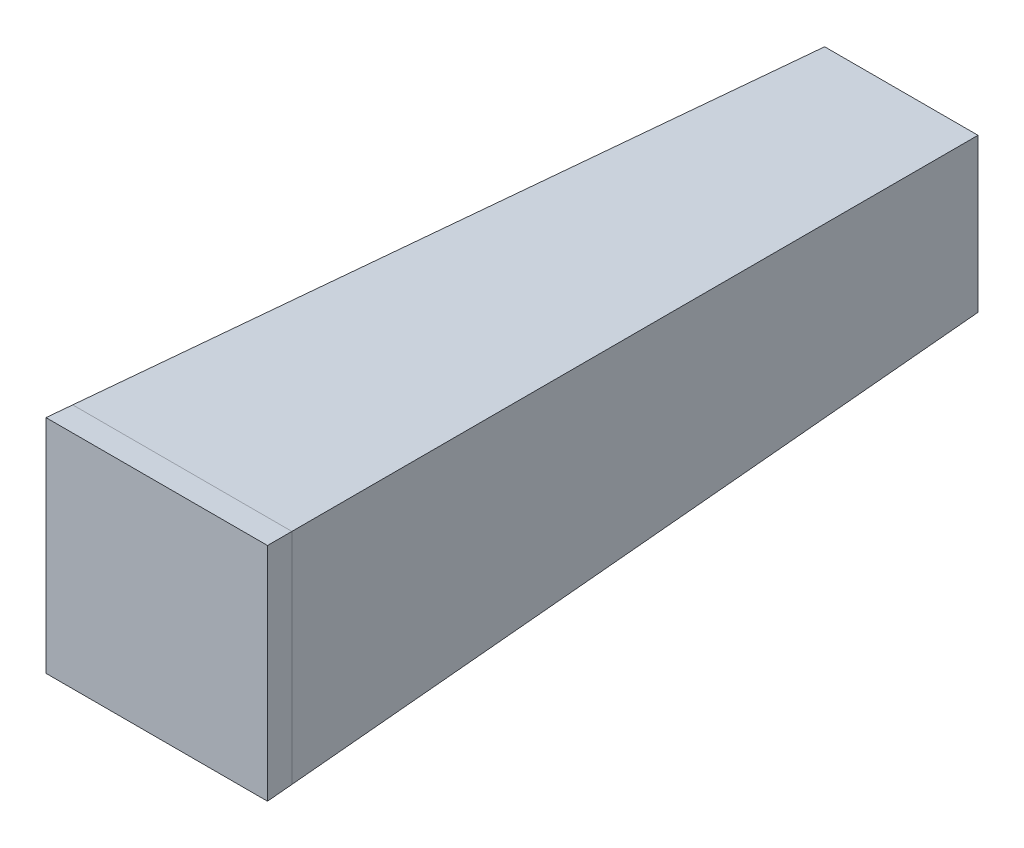
ISO-10303-21;
HEADER;
FILE_DESCRIPTION(('STEP AP214'),'2;1');
FILE_NAME('part.step','',(''),(''),'','','');
FILE_SCHEMA(('AUTOMOTIVE_DESIGN { 1 0 10303 214 1 1 1 1 }'));
ENDSEC;
DATA;
#1=APPLICATION_CONTEXT('core data for automotive mechanical design processes');
#2=APPLICATION_PROTOCOL_DEFINITION('international standard','automotive_design',2000,#1);
#3=PRODUCT_CONTEXT('',#1,'mechanical');
#4=PRODUCT('Part','Part','',(#3));
#5=PRODUCT_RELATED_PRODUCT_CATEGORY('part','',(#4));
#6=PRODUCT_DEFINITION_FORMATION('','',#4);
#7=PRODUCT_DEFINITION_CONTEXT('part definition',#1,'design');
#8=PRODUCT_DEFINITION('design','',#6,#7);
#9=PRODUCT_DEFINITION_SHAPE('','',#8);
#10=(LENGTH_UNIT() NAMED_UNIT(*) SI_UNIT(.MILLI.,.METRE.));
#11=(NAMED_UNIT(*) PLANE_ANGLE_UNIT() SI_UNIT($,.RADIAN.));
#12=(NAMED_UNIT(*) SI_UNIT($,.STERADIAN.) SOLID_ANGLE_UNIT());
#13=UNCERTAINTY_MEASURE_WITH_UNIT(LENGTH_MEASURE(1.E-05),#10,'distance_accuracy_value','');
#14=(GEOMETRIC_REPRESENTATION_CONTEXT(3) GLOBAL_UNCERTAINTY_ASSIGNED_CONTEXT((#13)) GLOBAL_UNIT_ASSIGNED_CONTEXT((#10,
#11,#12)) REPRESENTATION_CONTEXT('',''));
#15=CARTESIAN_POINT('',(0.,0.,0.));
#16=DIRECTION('',(0.,0.,1.));
#17=DIRECTION('',(1.,0.,0.));
#18=AXIS2_PLACEMENT_3D('',#15,#16,#17);
#19=CARTESIAN_POINT('',(241.993125845879,1.0333320773658E-13,-11.075200267546));
#20=DIRECTION('',(-0.998954351961386,0.,0.0457187346435417));
#21=DIRECTION('',(0.0457187346435417,0.,0.998954351961386));
#22=AXIS2_PLACEMENT_3D('',#19,#20,#21);
#23=PLANE('',#22);
#24=DIRECTION('',(0.,1.,0.));
#25=VECTOR('',#24,1.);
#26=CARTESIAN_POINT('',(281.12700228833,1.20043719532443E-13,844.));
#27=LINE('',#26,#25);
#28=CARTESIAN_POINT('',(281.12700228833,23.8729977116704,844.));
#29=VERTEX_POINT('',#28);
#30=CARTESIAN_POINT('',(281.12700228833,281.127002288329,844.));
#31=VERTEX_POINT('',#30);
#32=EDGE_CURVE('E111',#29,#31,#27,.T.);
#33=ORIENTED_EDGE('',*,*,#32,.F.);
#34=DIRECTION('',(0.0456710287056021,-0.0456710287056019,0.997911977217402));
#35=VECTOR('',#34,1.);
#36=CARTESIAN_POINT('',(242.5,62.5,0.));
#37=LINE('',#36,#35);
#38=CARTESIAN_POINT('',(242.5,62.5,0.));
#39=VERTEX_POINT('',#38);
#40=EDGE_CURVE('E162',#39,#29,#37,.T.);
#41=ORIENTED_EDGE('',*,*,#40,.F.);
#42=DIRECTION('',(0.,-1.,0.));
#43=VECTOR('',#42,1.);
#44=CARTESIAN_POINT('',(242.5,242.5,0.));
#45=LINE('',#44,#43);
#46=CARTESIAN_POINT('',(242.5,242.5,0.));
#47=VERTEX_POINT('',#46);
#48=EDGE_CURVE('E61',#47,#39,#45,.T.);
#49=ORIENTED_EDGE('',*,*,#48,.F.);
#50=DIRECTION('',(0.0456710287056019,0.0456710287056019,0.997911977217402));
#51=VECTOR('',#50,1.);
#52=CARTESIAN_POINT('',(242.5,242.5,0.));
#53=LINE('',#52,#51);
#54=EDGE_CURVE('E13',#47,#31,#53,.T.);
#55=ORIENTED_EDGE('',*,*,#54,.T.);
#56=EDGE_LOOP('',(#33,#41,#49,#55));
#57=FACE_BOUND('',#56,.T.);
#58=ADVANCED_FACE('F52',(#57),#23,.F.);
#59=CARTESIAN_POINT('',(0.,241.993125845879,-11.075200267546));
#60=DIRECTION('',(0.,-0.998954351961386,0.0457187346435418));
#61=DIRECTION('',(0.,-0.0457187346435418,-0.998954351961386));
#62=AXIS2_PLACEMENT_3D('',#59,#60,#61);
#63=PLANE('',#62);
#64=DIRECTION('',(-1.,0.,0.));
#65=VECTOR('',#64,1.);
#66=CARTESIAN_POINT('',(0.,281.12700228833,844.));
#67=LINE('',#66,#65);
#68=CARTESIAN_POINT('',(23.8729977116704,281.12700228833,844.));
#69=VERTEX_POINT('',#68);
#70=EDGE_CURVE('E119',#31,#69,#67,.T.);
#71=ORIENTED_EDGE('',*,*,#70,.F.);
#72=ORIENTED_EDGE('',*,*,#54,.F.);
#73=DIRECTION('',(1.,0.,0.));
#74=VECTOR('',#73,1.);
#75=CARTESIAN_POINT('',(242.5,242.5,0.));
#76=LINE('',#75,#74);
#77=CARTESIAN_POINT('',(62.5,242.5,0.));
#78=VERTEX_POINT('',#77);
#79=EDGE_CURVE('E69',#78,#47,#76,.T.);
#80=ORIENTED_EDGE('',*,*,#79,.F.);
#81=DIRECTION('',(-0.045671028705602,0.045671028705602,0.997911977217402));
#82=VECTOR('',#81,1.);
#83=CARTESIAN_POINT('',(62.5,242.5,0.));
#84=LINE('',#83,#82);
#85=EDGE_CURVE('E127',#78,#69,#84,.T.);
#86=ORIENTED_EDGE('',*,*,#85,.T.);
#87=EDGE_LOOP('',(#71,#72,#80,#86));
#88=FACE_BOUND('',#87,.T.);
#89=ADVANCED_FACE('F125',(#88),#63,.F.);
#90=CARTESIAN_POINT('',(0.,0.,0.));
#91=DIRECTION('',(0.,0.,1.));
#92=DIRECTION('',(1.,0.,0.));
#93=AXIS2_PLACEMENT_3D('',#90,#91,#92);
#94=PLANE('',#93);
#95=ORIENTED_EDGE('',*,*,#48,.T.);
#96=DIRECTION('',(-1.,0.,0.));
#97=VECTOR('',#96,1.);
#98=CARTESIAN_POINT('',(242.5,62.5,0.));
#99=LINE('',#98,#97);
#100=CARTESIAN_POINT('',(62.5,62.5000000000001,0.));
#101=VERTEX_POINT('',#100);
#102=EDGE_CURVE('E166',#39,#101,#99,.T.);
#103=ORIENTED_EDGE('',*,*,#102,.T.);
#104=DIRECTION('',(0.,1.,0.));
#105=VECTOR('',#104,1.);
#106=CARTESIAN_POINT('',(62.5,242.5,0.));
#107=LINE('',#106,#105);
#108=EDGE_CURVE('E152',#101,#78,#107,.T.);
#109=ORIENTED_EDGE('',*,*,#108,.T.);
#110=ORIENTED_EDGE('',*,*,#79,.T.);
#111=EDGE_LOOP('',(#95,#103,#109,#110));
#112=FACE_BOUND('',#111,.T.);
#113=ADVANCED_FACE('F206',(#112),#94,.F.);
#114=CARTESIAN_POINT('',(0.,0.,35.));
#115=DIRECTION('',(0.,0.,-1.));
#116=DIRECTION('',(-1.,0.,0.));
#117=AXIS2_PLACEMENT_3D('',#114,#115,#116);
#118=PLANE('',#117);
#119=DIRECTION('',(-1.,0.,0.));
#120=VECTOR('',#119,1.);
#121=CARTESIAN_POINT('',(0.,60.8981693363844,35.));
#122=LINE('',#121,#120);
#123=CARTESIAN_POINT('',(73.9117769896424,60.8981693363844,35.));
#124=VERTEX_POINT('',#123);
#125=CARTESIAN_POINT('',(60.8981693363844,60.8981693363844,35.));
#126=VERTEX_POINT('',#125);
#127=EDGE_CURVE('E160',#124,#126,#122,.T.);
#128=ORIENTED_EDGE('',*,*,#127,.F.);
#129=DIRECTION('',(0.,-1.,0.));
#130=VECTOR('',#129,1.);
#131=CARTESIAN_POINT('',(73.9117769897024,0.,35.));
#132=LINE('',#131,#130);
#133=CARTESIAN_POINT('',(73.9117769896424,231.088223010298,35.));
#134=VERTEX_POINT('',#133);
#135=EDGE_CURVE('E143',#134,#124,#132,.T.);
#136=ORIENTED_EDGE('',*,*,#135,.F.);
#137=DIRECTION('',(-1.,0.,0.));
#138=VECTOR('',#137,1.);
#139=CARTESIAN_POINT('',(0.,231.088223010298,35.));
#140=LINE('',#139,#138);
#141=CARTESIAN_POINT('',(60.8981693363844,231.088223010298,35.));
#142=VERTEX_POINT('',#141);
#143=EDGE_CURVE('E129',#134,#142,#140,.T.);
#144=ORIENTED_EDGE('',*,*,#143,.T.);
#145=DIRECTION('',(0.,1.,0.));
#146=VECTOR('',#145,1.);
#147=CARTESIAN_POINT('',(60.8981693363844,0.,35.));
#148=LINE('',#147,#146);
#149=EDGE_CURVE('E149',#126,#142,#148,.T.);
#150=ORIENTED_EDGE('',*,*,#149,.F.);
#151=EDGE_LOOP('',(#128,#136,#144,#150));
#152=FACE_BOUND('',#151,.T.);
#153=ADVANCED_FACE('F54',(#152),#118,.F.);
#154=CARTESIAN_POINT('',(0.,62.3693623314121,2.85443305864586));
#155=DIRECTION('',(0.,0.998954351961386,0.0457187346435418));
#156=DIRECTION('',(0.,-0.0457187346435418,0.998954351961386));
#157=AXIS2_PLACEMENT_3D('',#154,#155,#156);
#158=PLANE('',#157);
#159=ORIENTED_EDGE('',*,*,#40,.T.);
#160=DIRECTION('',(1.,0.,0.));
#161=VECTOR('',#160,1.);
#162=CARTESIAN_POINT('',(0.,23.8729977116705,844.));
#163=LINE('',#162,#161);
#164=CARTESIAN_POINT('',(36.8866053649885,23.8729977116705,844.));
#165=VERTEX_POINT('',#164);
#166=EDGE_CURVE('E122',#165,#29,#163,.T.);
#167=ORIENTED_EDGE('',*,*,#166,.F.);
#168=DIRECTION('',(-0.0456710287056019,-0.0456710287056019,0.997911977217402));
#169=VECTOR('',#168,1.);
#170=CARTESIAN_POINT('',(75.2257329547936,62.2121253014756,6.29006216275832));
#171=LINE('',#170,#169);
#172=EDGE_CURVE('E139',#124,#165,#171,.T.);
#173=ORIENTED_EDGE('',*,*,#172,.F.);
#174=ORIENTED_EDGE('',*,*,#127,.T.);
#175=DIRECTION('',(-0.0456710287056019,-0.045671028705602,0.997911977217402));
#176=VECTOR('',#175,1.);
#177=CARTESIAN_POINT('',(62.5,62.5,0.));
#178=LINE('',#177,#176);
#179=EDGE_CURVE('E142',#101,#126,#178,.T.);
#180=ORIENTED_EDGE('',*,*,#179,.F.);
#181=ORIENTED_EDGE('',*,*,#102,.F.);
#182=EDGE_LOOP('',(#159,#167,#173,#174,#180,#181));
#183=FACE_BOUND('',#182,.T.);
#184=ADVANCED_FACE('F198',(#183),#158,.F.);
#185=CARTESIAN_POINT('',(62.3693623314121,0.,2.85443305864586));
#186=DIRECTION('',(0.998954351961386,0.,0.0457187346435417));
#187=DIRECTION('',(0.0457187346435417,0.,-0.998954351961386));
#188=AXIS2_PLACEMENT_3D('',#185,#186,#187);
#189=PLANE('',#188);
#190=ORIENTED_EDGE('',*,*,#108,.F.);
#191=ORIENTED_EDGE('',*,*,#179,.T.);
#192=ORIENTED_EDGE('',*,*,#149,.T.);
#193=DIRECTION('',(-0.0456710287056019,0.045671028705602,0.997911977217402));
#194=VECTOR('',#193,1.);
#195=CARTESIAN_POINT('',(62.8483073746991,229.138084971983,-7.61051613717548));
#196=LINE('',#195,#194);
#197=CARTESIAN_POINT('',(23.8729977116705,268.113394635012,844.));
#198=VERTEX_POINT('',#197);
#199=EDGE_CURVE('E123',#142,#198,#196,.T.);
#200=ORIENTED_EDGE('',*,*,#199,.T.);
#201=DIRECTION('',(0.,-1.,0.));
#202=VECTOR('',#201,1.);
#203=CARTESIAN_POINT('',(23.8729977116705,0.,844.));
#204=LINE('',#203,#202);
#205=EDGE_CURVE('E128',#69,#198,#204,.T.);
#206=ORIENTED_EDGE('',*,*,#205,.F.);
#207=ORIENTED_EDGE('',*,*,#85,.F.);
#208=EDGE_LOOP('',(#190,#191,#192,#200,#206,#207));
#209=FACE_BOUND('',#208,.T.);
#210=ADVANCED_FACE('F204',(#209),#189,.F.);
#211=CARTESIAN_POINT('',(0.,229.006719270381,-10.4808567171799));
#212=DIRECTION('',(0.,0.998954351961386,-0.0457187346435418));
#213=DIRECTION('',(0.,0.0457187346435418,0.998954351961386));
#214=AXIS2_PLACEMENT_3D('',#211,#212,#213);
#215=PLANE('',#214);
#216=ORIENTED_EDGE('',*,*,#143,.F.);
#217=DIRECTION('',(-0.0456710287056019,0.045671028705602,0.997911977217402));
#218=VECTOR('',#217,1.);
#219=CARTESIAN_POINT('',(75.8347706873712,229.165229312629,-7.01741229406215));
#220=LINE('',#219,#218);
#221=CARTESIAN_POINT('',(36.8866053649885,268.113394635012,844.));
#222=VERTEX_POINT('',#221);
#223=EDGE_CURVE('E184',#134,#222,#220,.T.);
#224=ORIENTED_EDGE('',*,*,#223,.T.);
#225=DIRECTION('',(-1.,0.,0.));
#226=VECTOR('',#225,1.);
#227=CARTESIAN_POINT('',(0.,268.113394635012,844.));
#228=LINE('',#227,#226);
#229=EDGE_CURVE('E134',#222,#198,#228,.T.);
#230=ORIENTED_EDGE('',*,*,#229,.T.);
#231=ORIENTED_EDGE('',*,*,#199,.F.);
#232=EDGE_LOOP('',(#216,#224,#230,#231));
#233=FACE_BOUND('',#232,.T.);
#234=ADVANCED_FACE('F201',(#233),#215,.F.);
#235=CARTESIAN_POINT('',(0.,0.,844.));
#236=DIRECTION('',(0.,0.,1.));
#237=DIRECTION('',(1.,0.,0.));
#238=AXIS2_PLACEMENT_3D('',#235,#236,#237);
#239=PLANE('',#238);
#240=ORIENTED_EDGE('',*,*,#70,.T.);
#241=ORIENTED_EDGE('',*,*,#205,.T.);
#242=ORIENTED_EDGE('',*,*,#229,.F.);
#243=DIRECTION('',(0.,-1.,0.));
#244=VECTOR('',#243,1.);
#245=CARTESIAN_POINT('',(36.8866053649885,0.,844.));
#246=LINE('',#245,#244);
#247=EDGE_CURVE('E131',#222,#165,#246,.T.);
#248=ORIENTED_EDGE('',*,*,#247,.T.);
#249=ORIENTED_EDGE('',*,*,#166,.T.);
#250=ORIENTED_EDGE('',*,*,#32,.T.);
#251=EDGE_LOOP('',(#240,#241,#242,#248,#249,#250));
#252=FACE_BOUND('',#251,.T.);
#253=ADVANCED_FACE('F117',(#252),#239,.T.);
#254=CARTESIAN_POINT('',(75.3557689069101,0.,3.4487766090119));
#255=DIRECTION('',(-0.998954351961386,0.,-0.0457187346435417));
#256=DIRECTION('',(-0.0457187346435417,0.,0.998954351961386));
#257=AXIS2_PLACEMENT_3D('',#254,#255,#256);
#258=PLANE('',#257);
#259=ORIENTED_EDGE('',*,*,#247,.F.);
#260=ORIENTED_EDGE('',*,*,#223,.F.);
#261=ORIENTED_EDGE('',*,*,#135,.T.);
#262=ORIENTED_EDGE('',*,*,#172,.T.);
#263=EDGE_LOOP('',(#259,#260,#261,#262));
#264=FACE_BOUND('',#263,.T.);
#265=ADVANCED_FACE('F192',(#264),#258,.T.);
#266=CLOSED_SHELL('',(#58,#89,#113,#153,#184,#210,#234,#253,#265));
#267=MANIFOLD_SOLID_BREP('B2',#266);
#268=CARTESIAN_POINT('',(75.3557689069101,0.,3.4487766090119));
#269=DIRECTION('',(-0.998954351961386,0.,-0.0457187346435417));
#270=DIRECTION('',(-0.0457187346435417,0.,0.998954351961386));
#271=AXIS2_PLACEMENT_3D('',#268,#269,#270);
#272=PLANE('',#271);
#273=DIRECTION('',(0.,-1.,0.));
#274=VECTOR('',#273,1.);
#275=CARTESIAN_POINT('',(36.8866053649885,0.,844.));
#276=LINE('',#275,#274);
#277=CARTESIAN_POINT('',(36.8866053649885,268.113394635012,844.));
#278=VERTEX_POINT('',#277);
#279=CARTESIAN_POINT('',(36.8866053649885,23.8729977116705,844.));
#280=VERTEX_POINT('',#279);
#281=EDGE_CURVE('E365',#278,#280,#276,.T.);
#282=ORIENTED_EDGE('',*,*,#281,.T.);
#283=DIRECTION('',(-0.0456710287056019,-0.0456710287056019,0.997911977217402));
#284=VECTOR('',#283,1.);
#285=CARTESIAN_POINT('',(75.2257329547936,62.2121253014756,6.29006216275832));
#286=LINE('',#285,#284);
#287=CARTESIAN_POINT('',(73.9117769896424,60.8981693363844,35.));
#288=VERTEX_POINT('',#287);
#289=EDGE_CURVE('E322',#288,#280,#286,.T.);
#290=ORIENTED_EDGE('',*,*,#289,.F.);
#291=DIRECTION('',(0.,-1.,0.));
#292=VECTOR('',#291,1.);
#293=CARTESIAN_POINT('',(73.9117769897024,0.,35.));
#294=LINE('',#293,#292);
#295=CARTESIAN_POINT('',(73.9117769896424,231.088223010298,35.));
#296=VERTEX_POINT('',#295);
#297=EDGE_CURVE('E50',#296,#288,#294,.T.);
#298=ORIENTED_EDGE('',*,*,#297,.F.);
#299=DIRECTION('',(-0.0456710287056019,0.045671028705602,0.997911977217402));
#300=VECTOR('',#299,1.);
#301=CARTESIAN_POINT('',(75.8347706873712,229.165229312629,-7.01741229406215));
#302=LINE('',#301,#300);
#303=EDGE_CURVE('E301',#296,#278,#302,.T.);
#304=ORIENTED_EDGE('',*,*,#303,.T.);
#305=EDGE_LOOP('',(#282,#290,#298,#304));
#306=FACE_BOUND('',#305,.T.);
#307=ADVANCED_FACE('F297',(#306),#272,.F.);
#308=CARTESIAN_POINT('',(0.,229.006719270381,-10.4808567171799));
#309=DIRECTION('',(0.,0.998954351961386,-0.0457187346435418));
#310=DIRECTION('',(0.,0.0457187346435418,0.998954351961386));
#311=AXIS2_PLACEMENT_3D('',#308,#309,#310);
#312=PLANE('',#311);
#313=DIRECTION('',(-1.,0.,0.));
#314=VECTOR('',#313,1.);
#315=CARTESIAN_POINT('',(0.,268.113394635012,844.));
#316=LINE('',#315,#314);
#317=CARTESIAN_POINT('',(23.8729977116705,268.113394635012,844.));
#318=VERTEX_POINT('',#317);
#319=EDGE_CURVE('E347',#278,#318,#316,.T.);
#320=ORIENTED_EDGE('',*,*,#319,.F.);
#321=ORIENTED_EDGE('',*,*,#303,.F.);
#322=DIRECTION('',(-1.,0.,0.));
#323=VECTOR('',#322,1.);
#324=CARTESIAN_POINT('',(0.,231.088223010298,35.));
#325=LINE('',#324,#323);
#326=CARTESIAN_POINT('',(60.8981693363844,231.088223010298,35.));
#327=VERTEX_POINT('',#326);
#328=EDGE_CURVE('E346',#296,#327,#325,.T.);
#329=ORIENTED_EDGE('',*,*,#328,.T.);
#330=DIRECTION('',(-0.0456710287056019,0.045671028705602,0.997911977217402));
#331=VECTOR('',#330,1.);
#332=CARTESIAN_POINT('',(62.8483073746991,229.138084971983,-7.61051613717548));
#333=LINE('',#332,#331);
#334=EDGE_CURVE('E358',#327,#318,#333,.T.);
#335=ORIENTED_EDGE('',*,*,#334,.T.);
#336=EDGE_LOOP('',(#320,#321,#329,#335));
#337=FACE_BOUND('',#336,.T.);
#338=ADVANCED_FACE('F343',(#337),#312,.T.);
#339=CARTESIAN_POINT('',(0.,0.,35.));
#340=DIRECTION('',(0.,0.,-1.));
#341=DIRECTION('',(-1.,0.,0.));
#342=AXIS2_PLACEMENT_3D('',#339,#340,#341);
#343=PLANE('',#342);
#344=ORIENTED_EDGE('',*,*,#297,.T.);
#345=DIRECTION('',(-1.,0.,0.));
#346=VECTOR('',#345,1.);
#347=CARTESIAN_POINT('',(0.,60.8981693363844,35.));
#348=LINE('',#347,#346);
#349=CARTESIAN_POINT('',(60.8981693363844,60.8981693363844,35.));
#350=VERTEX_POINT('',#349);
#351=EDGE_CURVE('E356',#288,#350,#348,.T.);
#352=ORIENTED_EDGE('',*,*,#351,.T.);
#353=DIRECTION('',(0.,1.,0.));
#354=VECTOR('',#353,1.);
#355=CARTESIAN_POINT('',(60.8981693363844,0.,35.));
#356=LINE('',#355,#354);
#357=EDGE_CURVE('E354',#350,#327,#356,.T.);
#358=ORIENTED_EDGE('',*,*,#357,.T.);
#359=ORIENTED_EDGE('',*,*,#328,.F.);
#360=EDGE_LOOP('',(#344,#352,#358,#359));
#361=FACE_BOUND('',#360,.T.);
#362=ADVANCED_FACE('F352',(#361),#343,.T.);
#363=CARTESIAN_POINT('',(0.,0.,844.));
#364=DIRECTION('',(0.,0.,1.));
#365=DIRECTION('',(1.,0.,0.));
#366=AXIS2_PLACEMENT_3D('',#363,#364,#365);
#367=PLANE('',#366);
#368=ORIENTED_EDGE('',*,*,#281,.F.);
#369=ORIENTED_EDGE('',*,*,#319,.T.);
#370=DIRECTION('',(0.,-1.,0.));
#371=VECTOR('',#370,1.);
#372=CARTESIAN_POINT('',(23.8729977116705,0.,844.));
#373=LINE('',#372,#371);
#374=CARTESIAN_POINT('',(23.8729977116705,23.8729977116704,844.));
#375=VERTEX_POINT('',#374);
#376=EDGE_CURVE('E314',#318,#375,#373,.T.);
#377=ORIENTED_EDGE('',*,*,#376,.T.);
#378=DIRECTION('',(1.,0.,0.));
#379=VECTOR('',#378,1.);
#380=CARTESIAN_POINT('',(0.,23.8729977116705,844.));
#381=LINE('',#380,#379);
#382=EDGE_CURVE('E306',#375,#280,#381,.T.);
#383=ORIENTED_EDGE('',*,*,#382,.T.);
#384=EDGE_LOOP('',(#368,#369,#377,#383));
#385=FACE_BOUND('',#384,.T.);
#386=ADVANCED_FACE('F371',(#385),#367,.T.);
#387=CARTESIAN_POINT('',(0.,62.3693623314121,2.85443305864586));
#388=DIRECTION('',(0.,0.998954351961386,0.0457187346435418));
#389=DIRECTION('',(0.,-0.0457187346435418,0.998954351961386));
#390=AXIS2_PLACEMENT_3D('',#387,#388,#389);
#391=PLANE('',#390);
#392=ORIENTED_EDGE('',*,*,#351,.F.);
#393=ORIENTED_EDGE('',*,*,#289,.T.);
#394=ORIENTED_EDGE('',*,*,#382,.F.);
#395=DIRECTION('',(-0.0456710287056019,-0.045671028705602,0.997911977217402));
#396=VECTOR('',#395,1.);
#397=CARTESIAN_POINT('',(62.5,62.5,0.));
#398=LINE('',#397,#396);
#399=EDGE_CURVE('E363',#350,#375,#398,.T.);
#400=ORIENTED_EDGE('',*,*,#399,.F.);
#401=EDGE_LOOP('',(#392,#393,#394,#400));
#402=FACE_BOUND('',#401,.T.);
#403=ADVANCED_FACE('F299',(#402),#391,.F.);
#404=CARTESIAN_POINT('',(62.3693623314121,0.,2.85443305864586));
#405=DIRECTION('',(0.998954351961386,0.,0.0457187346435417));
#406=DIRECTION('',(0.0457187346435417,0.,-0.998954351961386));
#407=AXIS2_PLACEMENT_3D('',#404,#405,#406);
#408=PLANE('',#407);
#409=ORIENTED_EDGE('',*,*,#357,.F.);
#410=ORIENTED_EDGE('',*,*,#399,.T.);
#411=ORIENTED_EDGE('',*,*,#376,.F.);
#412=ORIENTED_EDGE('',*,*,#334,.F.);
#413=EDGE_LOOP('',(#409,#410,#411,#412));
#414=FACE_BOUND('',#413,.T.);
#415=ADVANCED_FACE('F373',(#414),#408,.F.);
#416=CLOSED_SHELL('',(#307,#338,#362,#386,#403,#415));
#417=MANIFOLD_SOLID_BREP('B7',#416);
#418=CARTESIAN_POINT('',(0.,0.,844.));
#419=DIRECTION('',(0.,0.,1.));
#420=DIRECTION('',(1.,0.,0.));
#421=AXIS2_PLACEMENT_3D('',#418,#419,#420);
#422=PLANE('',#421);
#423=DIRECTION('',(-1.,0.,0.));
#424=VECTOR('',#423,1.);
#425=CARTESIAN_POINT('',(0.,281.12700228833,844.));
#426=LINE('',#425,#424);
#427=CARTESIAN_POINT('',(281.12700228833,281.127002288329,844.));
#428=VERTEX_POINT('',#427);
#429=CARTESIAN_POINT('',(23.8729977116704,281.12700228833,844.));
#430=VERTEX_POINT('',#429);
#431=EDGE_CURVE('E504',#428,#430,#426,.T.);
#432=ORIENTED_EDGE('',*,*,#431,.F.);
#433=DIRECTION('',(0.,1.,0.));
#434=VECTOR('',#433,1.);
#435=CARTESIAN_POINT('',(281.12700228833,1.20043719532443E-13,844.));
#436=LINE('',#435,#434);
#437=CARTESIAN_POINT('',(281.12700228833,23.8729977116704,844.));
#438=VERTEX_POINT('',#437);
#439=EDGE_CURVE('E494',#438,#428,#436,.T.);
#440=ORIENTED_EDGE('',*,*,#439,.F.);
#441=DIRECTION('',(1.,0.,0.));
#442=VECTOR('',#441,1.);
#443=CARTESIAN_POINT('',(0.,23.8729977116705,844.));
#444=LINE('',#443,#442);
#445=CARTESIAN_POINT('',(23.8729977116705,23.8729977116704,844.));
#446=VERTEX_POINT('',#445);
#447=EDGE_CURVE('E429',#446,#438,#444,.T.);
#448=ORIENTED_EDGE('',*,*,#447,.F.);
#449=DIRECTION('',(0.,-1.,0.));
#450=VECTOR('',#449,1.);
#451=CARTESIAN_POINT('',(23.8729977116705,0.,844.));
#452=LINE('',#451,#450);
#453=EDGE_CURVE('E295',#430,#446,#452,.T.);
#454=ORIENTED_EDGE('',*,*,#453,.F.);
#455=EDGE_LOOP('',(#432,#440,#448,#454));
#456=FACE_BOUND('',#455,.T.);
#457=ADVANCED_FACE('F422',(#456),#422,.F.);
#458=CARTESIAN_POINT('',(62.3693623314121,0.,2.85443305864586));
#459=DIRECTION('',(0.998954351961386,0.,0.0457187346435417));
#460=DIRECTION('',(0.0457187346435417,0.,-0.998954351961386));
#461=AXIS2_PLACEMENT_3D('',#458,#459,#460);
#462=PLANE('',#461);
#463=DIRECTION('',(-0.045671028705602,0.045671028705602,0.997911977217402));
#464=VECTOR('',#463,1.);
#465=CARTESIAN_POINT('',(62.5,242.5,0.));
#466=LINE('',#465,#464);
#467=CARTESIAN_POINT('',(22.5,282.5,874.));
#468=VERTEX_POINT('',#467);
#469=EDGE_CURVE('E465',#430,#468,#466,.T.);
#470=ORIENTED_EDGE('',*,*,#469,.F.);
#471=ORIENTED_EDGE('',*,*,#453,.T.);
#472=DIRECTION('',(-0.0456710287056019,-0.045671028705602,0.997911977217402));
#473=VECTOR('',#472,1.);
#474=CARTESIAN_POINT('',(62.5,62.5,0.));
#475=LINE('',#474,#473);
#476=CARTESIAN_POINT('',(22.5,22.5,874.));
#477=VERTEX_POINT('',#476);
#478=EDGE_CURVE('E458',#446,#477,#475,.T.);
#479=ORIENTED_EDGE('',*,*,#478,.T.);
#480=DIRECTION('',(0.,-1.,0.));
#481=VECTOR('',#480,1.);
#482=CARTESIAN_POINT('',(22.5,282.5,874.));
#483=LINE('',#482,#481);
#484=EDGE_CURVE('E461',#468,#477,#483,.T.);
#485=ORIENTED_EDGE('',*,*,#484,.F.);
#486=EDGE_LOOP('',(#470,#471,#479,#485));
#487=FACE_BOUND('',#486,.T.);
#488=ADVANCED_FACE('F460',(#487),#462,.F.);
#489=CARTESIAN_POINT('',(0.,0.,874.));
#490=DIRECTION('',(0.,0.,-1.));
#491=DIRECTION('',(-1.,0.,0.));
#492=AXIS2_PLACEMENT_3D('',#489,#490,#491);
#493=PLANE('',#492);
#494=DIRECTION('',(-1.,0.,0.));
#495=VECTOR('',#494,1.);
#496=CARTESIAN_POINT('',(22.5,282.5,874.));
#497=LINE('',#496,#495);
#498=CARTESIAN_POINT('',(282.5,282.5,874.));
#499=VERTEX_POINT('',#498);
#500=EDGE_CURVE('E475',#499,#468,#497,.T.);
#501=ORIENTED_EDGE('',*,*,#500,.T.);
#502=ORIENTED_EDGE('',*,*,#484,.T.);
#503=DIRECTION('',(1.,0.,0.));
#504=VECTOR('',#503,1.);
#505=CARTESIAN_POINT('',(22.5,22.5,874.));
#506=LINE('',#505,#504);
#507=CARTESIAN_POINT('',(282.5,22.5,874.));
#508=VERTEX_POINT('',#507);
#509=EDGE_CURVE('E472',#477,#508,#506,.T.);
#510=ORIENTED_EDGE('',*,*,#509,.T.);
#511=DIRECTION('',(0.,1.,0.));
#512=VECTOR('',#511,1.);
#513=CARTESIAN_POINT('',(282.5,282.5,874.));
#514=LINE('',#513,#512);
#515=EDGE_CURVE('E479',#508,#499,#514,.T.);
#516=ORIENTED_EDGE('',*,*,#515,.T.);
#517=EDGE_LOOP('',(#501,#502,#510,#516));
#518=FACE_BOUND('',#517,.T.);
#519=ADVANCED_FACE('F470',(#518),#493,.F.);
#520=CARTESIAN_POINT('',(0.,241.993125845879,-11.075200267546));
#521=DIRECTION('',(0.,-0.998954351961386,0.0457187346435418));
#522=DIRECTION('',(0.,-0.0457187346435418,-0.998954351961386));
#523=AXIS2_PLACEMENT_3D('',#520,#521,#522);
#524=PLANE('',#523);
#525=DIRECTION('',(0.0456710287056019,0.0456710287056019,0.997911977217402));
#526=VECTOR('',#525,1.);
#527=CARTESIAN_POINT('',(242.5,242.5,0.));
#528=LINE('',#527,#526);
#529=EDGE_CURVE('E491',#428,#499,#528,.T.);
#530=ORIENTED_EDGE('',*,*,#529,.F.);
#531=ORIENTED_EDGE('',*,*,#431,.T.);
#532=ORIENTED_EDGE('',*,*,#469,.T.);
#533=ORIENTED_EDGE('',*,*,#500,.F.);
#534=EDGE_LOOP('',(#530,#531,#532,#533));
#535=FACE_BOUND('',#534,.T.);
#536=ADVANCED_FACE('F510',(#535),#524,.F.);
#537=CARTESIAN_POINT('',(0.,62.3693623314121,2.85443305864586));
#538=DIRECTION('',(0.,0.998954351961386,0.0457187346435418));
#539=DIRECTION('',(0.,-0.0457187346435418,0.998954351961386));
#540=AXIS2_PLACEMENT_3D('',#537,#538,#539);
#541=PLANE('',#540);
#542=ORIENTED_EDGE('',*,*,#478,.F.);
#543=ORIENTED_EDGE('',*,*,#447,.T.);
#544=DIRECTION('',(0.0456710287056021,-0.0456710287056019,0.997911977217402));
#545=VECTOR('',#544,1.);
#546=CARTESIAN_POINT('',(242.5,62.5,0.));
#547=LINE('',#546,#545);
#548=EDGE_CURVE('E466',#438,#508,#547,.T.);
#549=ORIENTED_EDGE('',*,*,#548,.T.);
#550=ORIENTED_EDGE('',*,*,#509,.F.);
#551=EDGE_LOOP('',(#542,#543,#549,#550));
#552=FACE_BOUND('',#551,.T.);
#553=ADVANCED_FACE('F477',(#552),#541,.F.);
#554=CARTESIAN_POINT('',(241.993125845879,1.0333320773658E-13,-11.075200267546));
#555=DIRECTION('',(-0.998954351961386,0.,0.0457187346435417));
#556=DIRECTION('',(0.0457187346435417,0.,0.998954351961386));
#557=AXIS2_PLACEMENT_3D('',#554,#555,#556);
#558=PLANE('',#557);
#559=ORIENTED_EDGE('',*,*,#548,.F.);
#560=ORIENTED_EDGE('',*,*,#439,.T.);
#561=ORIENTED_EDGE('',*,*,#529,.T.);
#562=ORIENTED_EDGE('',*,*,#515,.F.);
#563=EDGE_LOOP('',(#559,#560,#561,#562));
#564=FACE_BOUND('',#563,.T.);
#565=ADVANCED_FACE('F508',(#564),#558,.F.);
#566=CLOSED_SHELL('',(#457,#488,#519,#536,#553,#565));
#567=MANIFOLD_SOLID_BREP('B44',#566);
#568=ADVANCED_BREP_SHAPE_REPRESENTATION('',(#18,#267,#417,#567),#14);
#569=SHAPE_DEFINITION_REPRESENTATION(#9,#568);
ENDSEC;
END-ISO-10303-21;
